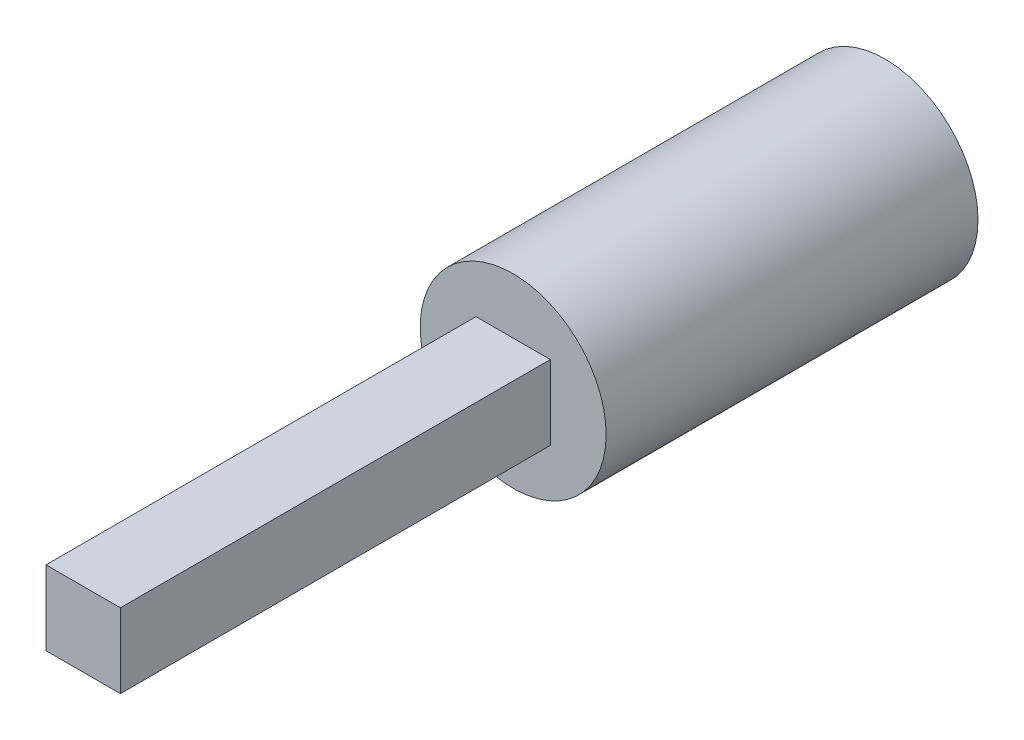
ISO-10303-21;
HEADER;
FILE_DESCRIPTION(('STEP AP214'),'2;1');
FILE_NAME('part.step','',(''),(''),'','','');
FILE_SCHEMA(('AUTOMOTIVE_DESIGN { 1 0 10303 214 1 1 1 1 }'));
ENDSEC;
DATA;
#1=APPLICATION_CONTEXT('core data for automotive mechanical design processes');
#2=APPLICATION_PROTOCOL_DEFINITION('international standard','automotive_design',2000,#1);
#3=PRODUCT_CONTEXT('',#1,'mechanical');
#4=PRODUCT('Part','Part','',(#3));
#5=PRODUCT_RELATED_PRODUCT_CATEGORY('part','',(#4));
#6=PRODUCT_DEFINITION_FORMATION('','',#4);
#7=PRODUCT_DEFINITION_CONTEXT('part definition',#1,'design');
#8=PRODUCT_DEFINITION('design','',#6,#7);
#9=PRODUCT_DEFINITION_SHAPE('','',#8);
#10=(LENGTH_UNIT() NAMED_UNIT(*) SI_UNIT(.MILLI.,.METRE.));
#11=(NAMED_UNIT(*) PLANE_ANGLE_UNIT() SI_UNIT($,.RADIAN.));
#12=(NAMED_UNIT(*) SI_UNIT($,.STERADIAN.) SOLID_ANGLE_UNIT());
#13=UNCERTAINTY_MEASURE_WITH_UNIT(LENGTH_MEASURE(1.E-05),#10,'distance_accuracy_value','');
#14=(GEOMETRIC_REPRESENTATION_CONTEXT(3) GLOBAL_UNCERTAINTY_ASSIGNED_CONTEXT((#13)) GLOBAL_UNIT_ASSIGNED_CONTEXT((#10,
#11,#12)) REPRESENTATION_CONTEXT('',''));
#15=CARTESIAN_POINT('',(0.,0.,0.));
#16=DIRECTION('',(0.,0.,1.));
#17=DIRECTION('',(1.,0.,0.));
#18=AXIS2_PLACEMENT_3D('',#15,#16,#17);
#19=CARTESIAN_POINT('',(0.,0.,16.));
#20=DIRECTION('',(0.,0.,-1.));
#21=DIRECTION('',(-1.,0.,0.));
#22=AXIS2_PLACEMENT_3D('',#19,#20,#21);
#23=CYLINDRICAL_SURFACE('',#22,4.);
#24=CARTESIAN_POINT('',(0.,0.,16.));
#25=DIRECTION('',(0.,0.,1.));
#26=DIRECTION('',(1.,0.,0.));
#27=AXIS2_PLACEMENT_3D('',#24,#25,#26);
#28=CIRCLE('',#27,4.);
#29=CARTESIAN_POINT('',(4.,0.,16.));
#30=VERTEX_POINT('',#29);
#31=EDGE_CURVE('E11',#30,#30,#28,.T.);
#32=ORIENTED_EDGE('',*,*,#31,.F.);
#33=EDGE_LOOP('',(#32));
#34=FACE_BOUND('',#33,.T.);
#35=CARTESIAN_POINT('',(0.,0.,0.));
#36=DIRECTION('',(0.,0.,1.));
#37=DIRECTION('',(1.,0.,0.));
#38=AXIS2_PLACEMENT_3D('',#35,#36,#37);
#39=CIRCLE('',#38,4.);
#40=CARTESIAN_POINT('',(4.,0.,0.));
#41=VERTEX_POINT('',#40);
#42=EDGE_CURVE('E36',#41,#41,#39,.T.);
#43=ORIENTED_EDGE('',*,*,#42,.T.);
#44=EDGE_LOOP('',(#43));
#45=FACE_BOUND('',#44,.T.);
#46=ADVANCED_FACE('F33',(#34,#45),#23,.T.);
#47=CARTESIAN_POINT('',(0.,0.,16.));
#48=DIRECTION('',(0.,0.,1.));
#49=DIRECTION('',(1.,0.,0.));
#50=AXIS2_PLACEMENT_3D('',#47,#48,#49);
#51=PLANE('',#50);
#52=DIRECTION('',(0.,1.,0.));
#53=VECTOR('',#52,1.);
#54=CARTESIAN_POINT('',(1.6,-1.6,16.));
#55=LINE('',#54,#53);
#56=CARTESIAN_POINT('',(1.6,-1.6,16.));
#57=VERTEX_POINT('',#56);
#58=CARTESIAN_POINT('',(1.6,1.6,16.));
#59=VERTEX_POINT('',#58);
#60=EDGE_CURVE('E47',#57,#59,#55,.T.);
#61=ORIENTED_EDGE('',*,*,#60,.F.);
#62=DIRECTION('',(1.,0.,0.));
#63=VECTOR('',#62,1.);
#64=CARTESIAN_POINT('',(-1.6,-1.6,16.));
#65=LINE('',#64,#63);
#66=CARTESIAN_POINT('',(-1.6,-1.6,16.));
#67=VERTEX_POINT('',#66);
#68=EDGE_CURVE('E51',#67,#57,#65,.T.);
#69=ORIENTED_EDGE('',*,*,#68,.F.);
#70=DIRECTION('',(0.,-1.,0.));
#71=VECTOR('',#70,1.);
#72=CARTESIAN_POINT('',(-1.6,-1.6,16.));
#73=LINE('',#72,#71);
#74=CARTESIAN_POINT('',(-1.6,1.6,16.));
#75=VERTEX_POINT('',#74);
#76=EDGE_CURVE('E229',#75,#67,#73,.T.);
#77=ORIENTED_EDGE('',*,*,#76,.F.);
#78=DIRECTION('',(-1.,0.,0.));
#79=VECTOR('',#78,1.);
#80=CARTESIAN_POINT('',(-1.6,1.6,16.));
#81=LINE('',#80,#79);
#82=EDGE_CURVE('E235',#59,#75,#81,.T.);
#83=ORIENTED_EDGE('',*,*,#82,.F.);
#84=EDGE_LOOP('',(#61,#69,#77,#83));
#85=FACE_BOUND('',#84,.T.);
#86=ORIENTED_EDGE('',*,*,#31,.T.);
#87=EDGE_LOOP('',(#86));
#88=FACE_BOUND('',#87,.T.);
#89=ADVANCED_FACE('F147',(#85,#88),#51,.T.);
#90=CARTESIAN_POINT('',(0.,0.,0.));
#91=DIRECTION('',(0.,0.,1.));
#92=DIRECTION('',(1.,0.,0.));
#93=AXIS2_PLACEMENT_3D('',#90,#91,#92);
#94=PLANE('',#93);
#95=DIRECTION('',(-1.,0.,0.));
#96=VECTOR('',#95,1.);
#97=CARTESIAN_POINT('',(1.6583123951777,-2.5,0.));
#98=LINE('',#97,#96);
#99=CARTESIAN_POINT('',(1.6583123951777,-2.5,0.));
#100=VERTEX_POINT('',#99);
#101=CARTESIAN_POINT('',(-1.6583123951777,-2.5,0.));
#102=VERTEX_POINT('',#101);
#103=EDGE_CURVE('E107',#100,#102,#98,.T.);
#104=ORIENTED_EDGE('',*,*,#103,.F.);
#105=CARTESIAN_POINT('',(0.,0.,0.));
#106=DIRECTION('',(0.,0.,-1.));
#107=DIRECTION('',(-1.,0.,0.));
#108=AXIS2_PLACEMENT_3D('',#105,#106,#107);
#109=CIRCLE('',#108,3.);
#110=EDGE_CURVE('E105',#102,#100,#109,.T.);
#111=ORIENTED_EDGE('',*,*,#110,.F.);
#112=EDGE_LOOP('',(#104,#111));
#113=FACE_BOUND('',#112,.T.);
#114=ORIENTED_EDGE('',*,*,#42,.F.);
#115=EDGE_LOOP('',(#114));
#116=FACE_BOUND('',#115,.T.);
#117=ADVANCED_FACE('F133',(#113,#116),#94,.F.);
#118=CARTESIAN_POINT('',(0.,0.,14.));
#119=DIRECTION('',(0.,0.,-1.));
#120=DIRECTION('',(-1.,0.,0.));
#121=AXIS2_PLACEMENT_3D('',#118,#119,#120);
#122=CYLINDRICAL_SURFACE('',#121,3.);
#123=ORIENTED_EDGE('',*,*,#110,.T.);
#124=DIRECTION('',(0.,0.,-1.));
#125=VECTOR('',#124,1.);
#126=CARTESIAN_POINT('',(1.6583123951777,-2.5,14.));
#127=LINE('',#126,#125);
#128=CARTESIAN_POINT('',(1.6583123951777,-2.5,14.));
#129=VERTEX_POINT('',#128);
#130=EDGE_CURVE('E118',#129,#100,#127,.T.);
#131=ORIENTED_EDGE('',*,*,#130,.F.);
#132=CARTESIAN_POINT('',(0.,0.,14.));
#133=DIRECTION('',(0.,0.,-1.));
#134=DIRECTION('',(-1.,0.,0.));
#135=AXIS2_PLACEMENT_3D('',#132,#133,#134);
#136=CIRCLE('',#135,3.);
#137=CARTESIAN_POINT('',(-1.6583123951777,-2.5,14.));
#138=VERTEX_POINT('',#137);
#139=EDGE_CURVE('E113',#138,#129,#136,.T.);
#140=ORIENTED_EDGE('',*,*,#139,.F.);
#141=DIRECTION('',(0.,0.,-1.));
#142=VECTOR('',#141,1.);
#143=CARTESIAN_POINT('',(-1.6583123951777,-2.5,14.));
#144=LINE('',#143,#142);
#145=EDGE_CURVE('E122',#138,#102,#144,.T.);
#146=ORIENTED_EDGE('',*,*,#145,.T.);
#147=EDGE_LOOP('',(#123,#131,#140,#146));
#148=FACE_BOUND('',#147,.T.);
#149=ADVANCED_FACE('F135',(#148),#122,.F.);
#150=CARTESIAN_POINT('',(1.6583123951777,-2.5,14.));
#151=DIRECTION('',(0.,-1.,0.));
#152=DIRECTION('',(0.,0.,-1.));
#153=AXIS2_PLACEMENT_3D('',#150,#151,#152);
#154=PLANE('',#153);
#155=ORIENTED_EDGE('',*,*,#103,.T.);
#156=ORIENTED_EDGE('',*,*,#145,.F.);
#157=DIRECTION('',(-1.,0.,0.));
#158=VECTOR('',#157,1.);
#159=CARTESIAN_POINT('',(1.6583123951777,-2.5,14.));
#160=LINE('',#159,#158);
#161=EDGE_CURVE('E116',#129,#138,#160,.T.);
#162=ORIENTED_EDGE('',*,*,#161,.F.);
#163=ORIENTED_EDGE('',*,*,#130,.T.);
#164=EDGE_LOOP('',(#155,#156,#162,#163));
#165=FACE_BOUND('',#164,.T.);
#166=ADVANCED_FACE('F128',(#165),#154,.F.);
#167=CARTESIAN_POINT('',(0.,0.,14.));
#168=DIRECTION('',(0.,0.,-1.));
#169=DIRECTION('',(-1.,0.,0.));
#170=AXIS2_PLACEMENT_3D('',#167,#168,#169);
#171=PLANE('',#170);
#172=ORIENTED_EDGE('',*,*,#139,.T.);
#173=ORIENTED_EDGE('',*,*,#161,.T.);
#174=EDGE_LOOP('',(#172,#173));
#175=FACE_BOUND('',#174,.T.);
#176=ADVANCED_FACE('F137',(#175),#171,.T.);
#177=CARTESIAN_POINT('',(1.6,-1.6,34.5));
#178=DIRECTION('',(-1.,0.,0.));
#179=DIRECTION('',(0.,0.,1.));
#180=AXIS2_PLACEMENT_3D('',#177,#178,#179);
#181=PLANE('',#180);
#182=ORIENTED_EDGE('',*,*,#60,.T.);
#183=DIRECTION('',(0.,0.,-1.));
#184=VECTOR('',#183,1.);
#185=CARTESIAN_POINT('',(1.6,1.6,34.5));
#186=LINE('',#185,#184);
#187=CARTESIAN_POINT('',(1.6,1.6,34.5));
#188=VERTEX_POINT('',#187);
#189=EDGE_CURVE('E88',#188,#59,#186,.T.);
#190=ORIENTED_EDGE('',*,*,#189,.F.);
#191=DIRECTION('',(0.,1.,0.));
#192=VECTOR('',#191,1.);
#193=CARTESIAN_POINT('',(1.6,-1.6,34.5));
#194=LINE('',#193,#192);
#195=CARTESIAN_POINT('',(1.6,-1.6,34.5));
#196=VERTEX_POINT('',#195);
#197=EDGE_CURVE('E94',#196,#188,#194,.T.);
#198=ORIENTED_EDGE('',*,*,#197,.F.);
#199=DIRECTION('',(0.,0.,-1.));
#200=VECTOR('',#199,1.);
#201=CARTESIAN_POINT('',(1.6,-1.6,34.5));
#202=LINE('',#201,#200);
#203=EDGE_CURVE('E227',#196,#57,#202,.T.);
#204=ORIENTED_EDGE('',*,*,#203,.T.);
#205=EDGE_LOOP('',(#182,#190,#198,#204));
#206=FACE_BOUND('',#205,.T.);
#207=ADVANCED_FACE('F104',(#206),#181,.F.);
#208=CARTESIAN_POINT('',(-1.6,1.6,34.5));
#209=DIRECTION('',(0.,-1.,0.));
#210=DIRECTION('',(0.,0.,-1.));
#211=AXIS2_PLACEMENT_3D('',#208,#209,#210);
#212=PLANE('',#211);
#213=ORIENTED_EDGE('',*,*,#82,.T.);
#214=DIRECTION('',(0.,0.,-1.));
#215=VECTOR('',#214,1.);
#216=CARTESIAN_POINT('',(-1.6,1.6,34.5));
#217=LINE('',#216,#215);
#218=CARTESIAN_POINT('',(-1.6,1.6,34.5));
#219=VERTEX_POINT('',#218);
#220=EDGE_CURVE('E90',#219,#75,#217,.T.);
#221=ORIENTED_EDGE('',*,*,#220,.F.);
#222=DIRECTION('',(-1.,0.,0.));
#223=VECTOR('',#222,1.);
#224=CARTESIAN_POINT('',(-1.6,1.6,34.5));
#225=LINE('',#224,#223);
#226=EDGE_CURVE('E83',#188,#219,#225,.T.);
#227=ORIENTED_EDGE('',*,*,#226,.F.);
#228=ORIENTED_EDGE('',*,*,#189,.T.);
#229=EDGE_LOOP('',(#213,#221,#227,#228));
#230=FACE_BOUND('',#229,.T.);
#231=ADVANCED_FACE('F86',(#230),#212,.F.);
#232=CARTESIAN_POINT('',(-1.6,-1.6,34.5));
#233=DIRECTION('',(1.,0.,0.));
#234=DIRECTION('',(0.,0.,-1.));
#235=AXIS2_PLACEMENT_3D('',#232,#233,#234);
#236=PLANE('',#235);
#237=ORIENTED_EDGE('',*,*,#76,.T.);
#238=DIRECTION('',(0.,0.,-1.));
#239=VECTOR('',#238,1.);
#240=CARTESIAN_POINT('',(-1.6,-1.6,34.5));
#241=LINE('',#240,#239);
#242=CARTESIAN_POINT('',(-1.6,-1.6,34.5));
#243=VERTEX_POINT('',#242);
#244=EDGE_CURVE('E109',#243,#67,#241,.T.);
#245=ORIENTED_EDGE('',*,*,#244,.F.);
#246=DIRECTION('',(0.,-1.,0.));
#247=VECTOR('',#246,1.);
#248=CARTESIAN_POINT('',(-1.6,-1.6,34.5));
#249=LINE('',#248,#247);
#250=EDGE_CURVE('E93',#219,#243,#249,.T.);
#251=ORIENTED_EDGE('',*,*,#250,.F.);
#252=ORIENTED_EDGE('',*,*,#220,.T.);
#253=EDGE_LOOP('',(#237,#245,#251,#252));
#254=FACE_BOUND('',#253,.T.);
#255=ADVANCED_FACE('F195',(#254),#236,.F.);
#256=CARTESIAN_POINT('',(-1.6,-1.6,34.5));
#257=DIRECTION('',(0.,1.,0.));
#258=DIRECTION('',(0.,0.,1.));
#259=AXIS2_PLACEMENT_3D('',#256,#257,#258);
#260=PLANE('',#259);
#261=ORIENTED_EDGE('',*,*,#68,.T.);
#262=ORIENTED_EDGE('',*,*,#203,.F.);
#263=DIRECTION('',(1.,0.,0.));
#264=VECTOR('',#263,1.);
#265=CARTESIAN_POINT('',(-1.6,-1.6,34.5));
#266=LINE('',#265,#264);
#267=EDGE_CURVE('E99',#243,#196,#266,.T.);
#268=ORIENTED_EDGE('',*,*,#267,.F.);
#269=ORIENTED_EDGE('',*,*,#244,.T.);
#270=EDGE_LOOP('',(#261,#262,#268,#269));
#271=FACE_BOUND('',#270,.T.);
#272=ADVANCED_FACE('F204',(#271),#260,.F.);
#273=CARTESIAN_POINT('',(0.,0.,34.5));
#274=DIRECTION('',(0.,0.,-1.));
#275=DIRECTION('',(-1.,0.,0.));
#276=AXIS2_PLACEMENT_3D('',#273,#274,#275);
#277=PLANE('',#276);
#278=ORIENTED_EDGE('',*,*,#197,.T.);
#279=ORIENTED_EDGE('',*,*,#226,.T.);
#280=ORIENTED_EDGE('',*,*,#250,.T.);
#281=ORIENTED_EDGE('',*,*,#267,.T.);
#282=EDGE_LOOP('',(#278,#279,#280,#281));
#283=FACE_BOUND('',#282,.T.);
#284=ADVANCED_FACE('F97',(#283),#277,.F.);
#285=CLOSED_SHELL('',(#46,#89,#117,#149,#166,#176,#207,#231,#255,#272,#284));
#286=MANIFOLD_SOLID_BREP('B2',#285);
#287=ADVANCED_BREP_SHAPE_REPRESENTATION('',(#18,#286),#14);
#288=SHAPE_DEFINITION_REPRESENTATION(#9,#287);
ENDSEC;
END-ISO-10303-21;
